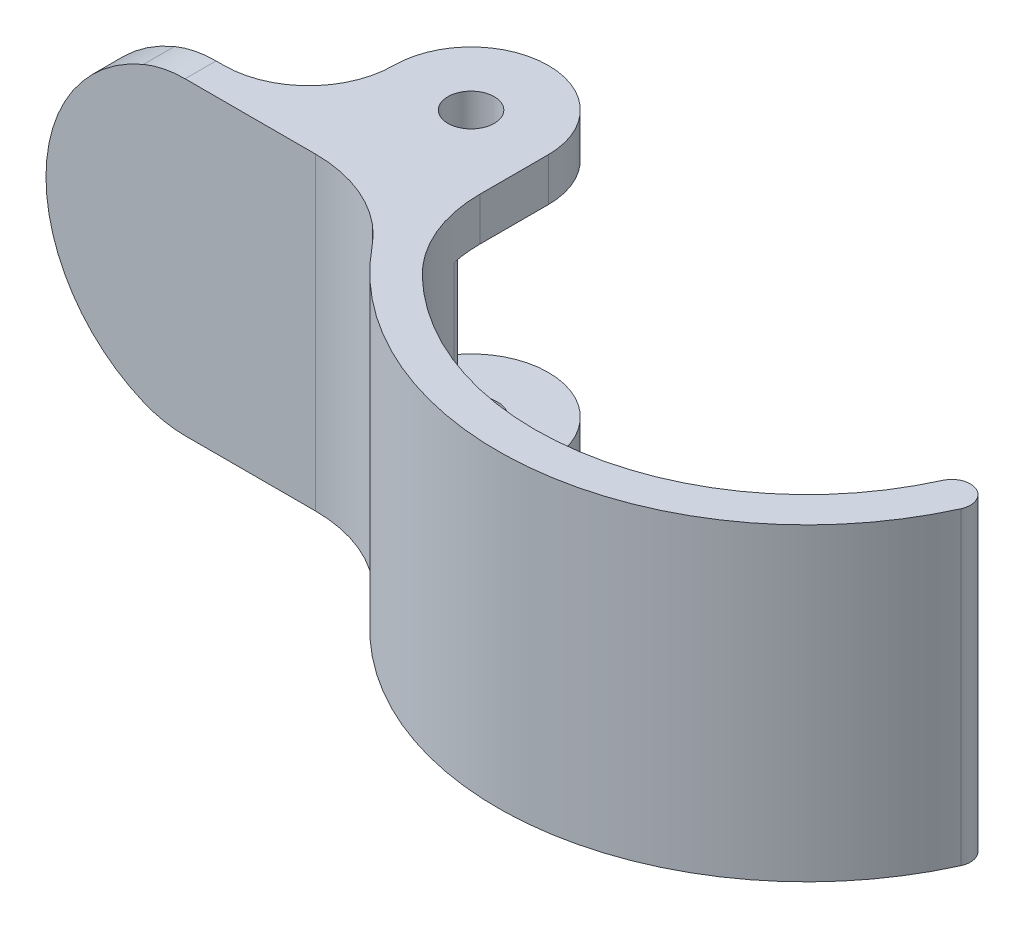
ISO-10303-21;
HEADER;
FILE_DESCRIPTION(('STEP AP214'),'2;1');
FILE_NAME('part.step','',(''),(''),'','','');
FILE_SCHEMA(('AUTOMOTIVE_DESIGN { 1 0 10303 214 1 1 1 1 }'));
ENDSEC;
DATA;
#1=APPLICATION_CONTEXT('core data for automotive mechanical design processes');
#2=APPLICATION_PROTOCOL_DEFINITION('international standard','automotive_design',2000,#1);
#3=PRODUCT_CONTEXT('',#1,'mechanical');
#4=PRODUCT('Part','Part','',(#3));
#5=PRODUCT_RELATED_PRODUCT_CATEGORY('part','',(#4));
#6=PRODUCT_DEFINITION_FORMATION('','',#4);
#7=PRODUCT_DEFINITION_CONTEXT('part definition',#1,'design');
#8=PRODUCT_DEFINITION('design','',#6,#7);
#9=PRODUCT_DEFINITION_SHAPE('','',#8);
#10=(LENGTH_UNIT() NAMED_UNIT(*) SI_UNIT(.MILLI.,.METRE.));
#11=(NAMED_UNIT(*) PLANE_ANGLE_UNIT() SI_UNIT($,.RADIAN.));
#12=(NAMED_UNIT(*) SI_UNIT($,.STERADIAN.) SOLID_ANGLE_UNIT());
#13=UNCERTAINTY_MEASURE_WITH_UNIT(LENGTH_MEASURE(1.E-05),#10,'distance_accuracy_value','');
#14=(GEOMETRIC_REPRESENTATION_CONTEXT(3) GLOBAL_UNCERTAINTY_ASSIGNED_CONTEXT((#13)) GLOBAL_UNIT_ASSIGNED_CONTEXT((#10,
#11,#12)) REPRESENTATION_CONTEXT('',''));
#15=CARTESIAN_POINT('',(0.,0.,0.));
#16=DIRECTION('',(0.,0.,1.));
#17=DIRECTION('',(1.,0.,0.));
#18=AXIS2_PLACEMENT_3D('',#15,#16,#17);
#19=CARTESIAN_POINT('',(5.,-10.,2.));
#20=DIRECTION('',(-1.,0.,0.));
#21=DIRECTION('',(0.,0.,1.));
#22=AXIS2_PLACEMENT_3D('',#19,#20,#21);
#23=PLANE('',#22);
#24=DIRECTION('',(0.,0.,-1.));
#25=VECTOR('',#24,1.);
#26=CARTESIAN_POINT('',(5.,10.,2.));
#27=LINE('',#26,#25);
#28=CARTESIAN_POINT('',(5.,10.,-1.06686940409686));
#29=VERTEX_POINT('',#28);
#30=CARTESIAN_POINT('',(5.,10.,-5.5));
#31=VERTEX_POINT('',#30);
#32=EDGE_CURVE('E262',#29,#31,#27,.T.);
#33=ORIENTED_EDGE('',*,*,#32,.F.);
#34=DIRECTION('',(0.,1.,0.));
#35=VECTOR('',#34,1.);
#36=CARTESIAN_POINT('',(5.,-10.,-1.06686940409686));
#37=LINE('',#36,#35);
#38=CARTESIAN_POINT('',(5.,7.2,-1.06686940409686));
#39=VERTEX_POINT('',#38);
#40=EDGE_CURVE('E305',#29,#39,#37,.F.);
#41=ORIENTED_EDGE('',*,*,#40,.T.);
#42=DIRECTION('',(0.,0.,-1.));
#43=VECTOR('',#42,1.);
#44=CARTESIAN_POINT('',(5.,7.2,0.));
#45=LINE('',#44,#43);
#46=CARTESIAN_POINT('',(5.,7.2,-5.5));
#47=VERTEX_POINT('',#46);
#48=EDGE_CURVE('E234',#39,#47,#45,.T.);
#49=ORIENTED_EDGE('',*,*,#48,.T.);
#50=DIRECTION('',(0.,1.,0.));
#51=VECTOR('',#50,1.);
#52=CARTESIAN_POINT('',(5.,7.2,-5.5));
#53=LINE('',#52,#51);
#54=EDGE_CURVE('E242',#47,#31,#53,.T.);
#55=ORIENTED_EDGE('',*,*,#54,.T.);
#56=EDGE_LOOP('',(#33,#41,#49,#55));
#57=FACE_BOUND('',#56,.T.);
#58=ADVANCED_FACE('F33',(#57),#23,.F.);
#59=DIRECTION('',(0.,0.,-1.));
#60=VECTOR('',#59,1.);
#61=CARTESIAN_POINT('',(5.,-7.2,0.));
#62=LINE('',#61,#60);
#63=CARTESIAN_POINT('',(5.,-7.2,-1.06686940409686));
#64=VERTEX_POINT('',#63);
#65=CARTESIAN_POINT('',(5.,-7.2,-5.5));
#66=VERTEX_POINT('',#65);
#67=EDGE_CURVE('E211',#64,#66,#62,.T.);
#68=ORIENTED_EDGE('',*,*,#67,.F.);
#69=DIRECTION('',(0.,1.,0.));
#70=VECTOR('',#69,1.);
#71=CARTESIAN_POINT('',(5.,-10.,-1.06686940409686));
#72=LINE('',#71,#70);
#73=CARTESIAN_POINT('',(5.,-10.,-1.06686940409686));
#74=VERTEX_POINT('',#73);
#75=EDGE_CURVE('E303',#64,#74,#72,.F.);
#76=ORIENTED_EDGE('',*,*,#75,.T.);
#77=DIRECTION('',(0.,0.,-1.));
#78=VECTOR('',#77,1.);
#79=CARTESIAN_POINT('',(5.,-10.,2.));
#80=LINE('',#79,#78);
#81=CARTESIAN_POINT('',(5.,-10.,-5.5));
#82=VERTEX_POINT('',#81);
#83=EDGE_CURVE('E257',#74,#82,#80,.T.);
#84=ORIENTED_EDGE('',*,*,#83,.T.);
#85=DIRECTION('',(0.,-1.,0.));
#86=VECTOR('',#85,1.);
#87=CARTESIAN_POINT('',(5.,-7.2,-5.5));
#88=LINE('',#87,#86);
#89=EDGE_CURVE('E222',#66,#82,#88,.T.);
#90=ORIENTED_EDGE('',*,*,#89,.F.);
#91=EDGE_LOOP('',(#68,#76,#84,#90));
#92=FACE_BOUND('',#91,.T.);
#93=ADVANCED_FACE('F385',(#92),#23,.F.);
#94=CARTESIAN_POINT('',(-12.,10.,2.));
#95=DIRECTION('',(0.,-1.,0.));
#96=DIRECTION('',(0.,0.,-1.));
#97=AXIS2_PLACEMENT_3D('',#94,#95,#96);
#98=PLANE('',#97);
#99=DIRECTION('',(-1.,0.,0.));
#100=VECTOR('',#99,1.);
#101=CARTESIAN_POINT('',(-12.,10.,2.));
#102=LINE('',#101,#100);
#103=CARTESIAN_POINT('',(-2.56234204113904,10.,2.));
#104=VERTEX_POINT('',#103);
#105=CARTESIAN_POINT('',(-11.,10.,2.));
#106=VERTEX_POINT('',#105);
#107=EDGE_CURVE('E251',#104,#106,#102,.T.);
#108=ORIENTED_EDGE('',*,*,#107,.F.);
#109=CARTESIAN_POINT('',(-2.56234204113904,10.,11.));
#110=DIRECTION('',(0.,-1.,0.));
#111=DIRECTION('',(0.,0.,-1.));
#112=AXIS2_PLACEMENT_3D('',#109,#110,#111);
#113=CIRCLE('',#112,9.);
#114=CARTESIAN_POINT('',(4.42955467771192,10.,5.33313311671068));
#115=VERTEX_POINT('',#114);
#116=EDGE_CURVE('E172',#104,#115,#113,.T.);
#117=ORIENTED_EDGE('',*,*,#116,.T.);
#118=CARTESIAN_POINT('',(19.9671029418252,10.,-7.25990440171003));
#119=DIRECTION('',(0.,1.,0.));
#120=DIRECTION('',(0.,0.,1.));
#121=AXIS2_PLACEMENT_3D('',#118,#119,#120);
#122=CIRCLE('',#121,20.);
#123=CARTESIAN_POINT('',(38.1863041442966,10.,0.989986963869551));
#124=VERTEX_POINT('',#123);
#125=EDGE_CURVE('E164',#115,#124,#122,.T.);
#126=ORIENTED_EDGE('',*,*,#125,.T.);
#127=CARTESIAN_POINT('',(37.0931520721483,10.,0.494993481934777));
#128=DIRECTION('',(0.,1.,0.));
#129=DIRECTION('',(0.,0.,-1.));
#130=AXIS2_PLACEMENT_3D('',#127,#128,#129);
#131=CIRCLE('',#130,1.2);
#132=CARTESIAN_POINT('',(36.,10.,0.));
#133=VERTEX_POINT('',#132);
#134=EDGE_CURVE('E171',#124,#133,#131,.T.);
#135=ORIENTED_EDGE('',*,*,#134,.T.);
#136=CARTESIAN_POINT('',(19.9671029418252,10.,-7.25990440171003));
#137=DIRECTION('',(0.,-1.,0.));
#138=DIRECTION('',(0.,0.,1.));
#139=AXIS2_PLACEMENT_3D('',#136,#137,#138);
#140=CIRCLE('',#139,17.6);
#141=CARTESIAN_POINT('',(7.75535738646205,10.,5.41421373294018));
#142=VERTEX_POINT('',#141);
#143=EDGE_CURVE('E185',#133,#142,#140,.T.);
#144=ORIENTED_EDGE('',*,*,#143,.T.);
#145=CARTESIAN_POINT('',(14.,10.,-1.06686940409686));
#146=DIRECTION('',(0.,-1.,0.));
#147=DIRECTION('',(0.,0.,-1.));
#148=AXIS2_PLACEMENT_3D('',#145,#146,#147);
#149=CIRCLE('',#148,9.);
#150=EDGE_CURVE('E307',#142,#29,#149,.T.);
#151=ORIENTED_EDGE('',*,*,#150,.T.);
#152=ORIENTED_EDGE('',*,*,#32,.T.);
#153=CARTESIAN_POINT('',(0.,10.,-5.5));
#154=DIRECTION('',(0.,1.,0.));
#155=DIRECTION('',(0.,0.,-1.));
#156=AXIS2_PLACEMENT_3D('',#153,#154,#155);
#157=CIRCLE('',#156,5.);
#158=CARTESIAN_POINT('',(-5.,10.,-5.5));
#159=VERTEX_POINT('',#158);
#160=EDGE_CURVE('E231',#31,#159,#157,.T.);
#161=ORIENTED_EDGE('',*,*,#160,.T.);
#162=CARTESIAN_POINT('',(-10.5,10.,-5.5));
#163=DIRECTION('',(0.,-1.,0.));
#164=DIRECTION('',(0.,0.,-1.));
#165=AXIS2_PLACEMENT_3D('',#162,#163,#164);
#166=CIRCLE('',#165,5.5);
#167=CARTESIAN_POINT('',(-10.5,10.,0.));
#168=VERTEX_POINT('',#167);
#169=EDGE_CURVE('E267',#159,#168,#166,.T.);
#170=ORIENTED_EDGE('',*,*,#169,.T.);
#171=DIRECTION('',(-1.,0.,0.));
#172=VECTOR('',#171,1.);
#173=CARTESIAN_POINT('',(-12.,10.,0.));
#174=LINE('',#173,#172);
#175=CARTESIAN_POINT('',(-11.,10.,0.));
#176=VERTEX_POINT('',#175);
#177=EDGE_CURVE('E248',#168,#176,#174,.T.);
#178=ORIENTED_EDGE('',*,*,#177,.T.);
#179=DIRECTION('',(0.,0.,-1.));
#180=VECTOR('',#179,1.);
#181=CARTESIAN_POINT('',(-11.,10.,2.));
#182=LINE('',#181,#180);
#183=EDGE_CURVE('E297',#176,#106,#182,.F.);
#184=ORIENTED_EDGE('',*,*,#183,.T.);
#185=EDGE_LOOP('',(#108,#117,#126,#135,#144,#151,#152,#161,#170,#178,#184));
#186=FACE_BOUND('',#185,.T.);
#187=CARTESIAN_POINT('',(0.,10.,-5.5));
#188=DIRECTION('',(0.,1.,0.));
#189=DIRECTION('',(0.,0.,1.));
#190=AXIS2_PLACEMENT_3D('',#187,#188,#189);
#191=CIRCLE('',#190,1.5);
#192=CARTESIAN_POINT('',(0.,10.,-4.));
#193=VERTEX_POINT('',#192);
#194=EDGE_CURVE('E225',#193,#193,#191,.T.);
#195=ORIENTED_EDGE('',*,*,#194,.F.);
#196=EDGE_LOOP('',(#195));
#197=FACE_BOUND('',#196,.T.);
#198=ADVANCED_FACE('F167',(#186,#197),#98,.F.);
#199=CARTESIAN_POINT('',(-12.,-10.,2.));
#200=DIRECTION('',(0.,1.,0.));
#201=DIRECTION('',(0.,0.,1.));
#202=AXIS2_PLACEMENT_3D('',#199,#200,#201);
#203=PLANE('',#202);
#204=CARTESIAN_POINT('',(19.9671029418252,-10.,-7.25990440171003));
#205=DIRECTION('',(0.,1.,0.));
#206=DIRECTION('',(0.,0.,1.));
#207=AXIS2_PLACEMENT_3D('',#204,#205,#206);
#208=CIRCLE('',#207,20.);
#209=CARTESIAN_POINT('',(38.1863041442966,-10.,0.98998696386955));
#210=VERTEX_POINT('',#209);
#211=CARTESIAN_POINT('',(4.42955467771192,-10.,5.33313311671068));
#212=VERTEX_POINT('',#211);
#213=EDGE_CURVE('E181',#210,#212,#208,.F.);
#214=ORIENTED_EDGE('',*,*,#213,.T.);
#215=CARTESIAN_POINT('',(-2.56234204113904,-10.,11.));
#216=DIRECTION('',(0.,1.,0.));
#217=DIRECTION('',(0.,0.,1.));
#218=AXIS2_PLACEMENT_3D('',#215,#216,#217);
#219=CIRCLE('',#218,9.);
#220=CARTESIAN_POINT('',(-2.56234204113904,-10.,2.));
#221=VERTEX_POINT('',#220);
#222=EDGE_CURVE('E319',#212,#221,#219,.T.);
#223=ORIENTED_EDGE('',*,*,#222,.T.);
#224=DIRECTION('',(1.,0.,0.));
#225=VECTOR('',#224,1.);
#226=CARTESIAN_POINT('',(-12.,-10.,2.));
#227=LINE('',#226,#225);
#228=CARTESIAN_POINT('',(-11.,-10.,2.));
#229=VERTEX_POINT('',#228);
#230=EDGE_CURVE('E253',#229,#221,#227,.T.);
#231=ORIENTED_EDGE('',*,*,#230,.F.);
#232=DIRECTION('',(0.,0.,-1.));
#233=VECTOR('',#232,1.);
#234=CARTESIAN_POINT('',(-11.,-10.,0.));
#235=LINE('',#234,#233);
#236=CARTESIAN_POINT('',(-11.,-10.,0.));
#237=VERTEX_POINT('',#236);
#238=EDGE_CURVE('E279',#229,#237,#235,.T.);
#239=ORIENTED_EDGE('',*,*,#238,.T.);
#240=DIRECTION('',(1.,0.,0.));
#241=VECTOR('',#240,1.);
#242=CARTESIAN_POINT('',(-12.,-10.,0.));
#243=LINE('',#242,#241);
#244=CARTESIAN_POINT('',(-10.5,-10.,0.));
#245=VERTEX_POINT('',#244);
#246=EDGE_CURVE('E254',#237,#245,#243,.T.);
#247=ORIENTED_EDGE('',*,*,#246,.T.);
#248=CARTESIAN_POINT('',(-10.5,-10.,-5.5));
#249=DIRECTION('',(0.,1.,0.));
#250=DIRECTION('',(0.,0.,1.));
#251=AXIS2_PLACEMENT_3D('',#248,#249,#250);
#252=CIRCLE('',#251,5.5);
#253=CARTESIAN_POINT('',(-5.,-10.,-5.5));
#254=VERTEX_POINT('',#253);
#255=EDGE_CURVE('E274',#245,#254,#252,.T.);
#256=ORIENTED_EDGE('',*,*,#255,.T.);
#257=CARTESIAN_POINT('',(0.,-10.,-5.5));
#258=DIRECTION('',(0.,1.,0.));
#259=DIRECTION('',(0.,0.,-1.));
#260=AXIS2_PLACEMENT_3D('',#257,#258,#259);
#261=CIRCLE('',#260,5.);
#262=EDGE_CURVE('E214',#82,#254,#261,.T.);
#263=ORIENTED_EDGE('',*,*,#262,.F.);
#264=ORIENTED_EDGE('',*,*,#83,.F.);
#265=CARTESIAN_POINT('',(14.,-10.,-1.06686940409686));
#266=DIRECTION('',(0.,1.,0.));
#267=DIRECTION('',(0.,0.,1.));
#268=AXIS2_PLACEMENT_3D('',#265,#266,#267);
#269=CIRCLE('',#268,9.);
#270=CARTESIAN_POINT('',(7.75535738646205,-10.,5.41421373294018));
#271=VERTEX_POINT('',#270);
#272=EDGE_CURVE('E311',#74,#271,#269,.T.);
#273=ORIENTED_EDGE('',*,*,#272,.T.);
#274=CARTESIAN_POINT('',(19.9671029418252,-10.,-7.25990440171003));
#275=DIRECTION('',(0.,1.,0.));
#276=DIRECTION('',(0.,0.,1.));
#277=AXIS2_PLACEMENT_3D('',#274,#275,#276);
#278=CIRCLE('',#277,17.6);
#279=CARTESIAN_POINT('',(36.,-10.,0.));
#280=VERTEX_POINT('',#279);
#281=EDGE_CURVE('E194',#271,#280,#278,.T.);
#282=ORIENTED_EDGE('',*,*,#281,.T.);
#283=CARTESIAN_POINT('',(37.0931520721483,-10.,0.494993481934777));
#284=DIRECTION('',(0.,1.,0.));
#285=DIRECTION('',(0.,0.,1.));
#286=AXIS2_PLACEMENT_3D('',#283,#284,#285);
#287=CIRCLE('',#286,1.2);
#288=EDGE_CURVE('E196',#280,#210,#287,.F.);
#289=ORIENTED_EDGE('',*,*,#288,.T.);
#290=EDGE_LOOP('',(#214,#223,#231,#239,#247,#256,#263,#264,#273,#282,#289));
#291=FACE_BOUND('',#290,.T.);
#292=CARTESIAN_POINT('',(0.,-10.,-5.5));
#293=DIRECTION('',(0.,-1.,0.));
#294=DIRECTION('',(0.,0.,-1.));
#295=AXIS2_PLACEMENT_3D('',#292,#293,#294);
#296=CIRCLE('',#295,3.15);
#297=CARTESIAN_POINT('',(0.,-10.,-8.65));
#298=VERTEX_POINT('',#297);
#299=EDGE_CURVE('E204',#298,#298,#296,.T.);
#300=ORIENTED_EDGE('',*,*,#299,.F.);
#301=EDGE_LOOP('',(#300));
#302=FACE_BOUND('',#301,.T.);
#303=ADVANCED_FACE('F370',(#291,#302),#203,.F.);
#304=CARTESIAN_POINT('',(0.,0.,2.));
#305=DIRECTION('',(0.,0.,-1.));
#306=DIRECTION('',(-1.,0.,0.));
#307=AXIS2_PLACEMENT_3D('',#304,#305,#306);
#308=PLANE('',#307);
#309=ORIENTED_EDGE('',*,*,#230,.T.);
#310=DIRECTION('',(0.,1.,0.));
#311=VECTOR('',#310,1.);
#312=CARTESIAN_POINT('',(-2.56234204113904,0.,2.));
#313=LINE('',#312,#311);
#314=EDGE_CURVE('E313',#221,#104,#313,.T.);
#315=ORIENTED_EDGE('',*,*,#314,.T.);
#316=ORIENTED_EDGE('',*,*,#107,.T.);
#317=CARTESIAN_POINT('',(-11.,3.,2.));
#318=DIRECTION('',(0.,0.,-1.));
#319=DIRECTION('',(-1.,0.,0.));
#320=AXIS2_PLACEMENT_3D('',#317,#318,#319);
#321=CIRCLE('',#320,7.);
#322=CARTESIAN_POINT('',(-13.6923076923077,9.46153846153847,2.));
#323=VERTEX_POINT('',#322);
#324=EDGE_CURVE('E293',#106,#323,#321,.F.);
#325=ORIENTED_EDGE('',*,*,#324,.T.);
#326=CARTESIAN_POINT('',(-9.75,0.,2.));
#327=DIRECTION('',(0.,0.,1.));
#328=DIRECTION('',(-1.,0.,0.));
#329=AXIS2_PLACEMENT_3D('',#326,#327,#328);
#330=CIRCLE('',#329,10.25);
#331=CARTESIAN_POINT('',(-13.6923076923077,-9.46153846153846,2.));
#332=VERTEX_POINT('',#331);
#333=EDGE_CURVE('E198',#323,#332,#330,.T.);
#334=ORIENTED_EDGE('',*,*,#333,.T.);
#335=CARTESIAN_POINT('',(-11.,-3.,2.));
#336=DIRECTION('',(0.,0.,-1.));
#337=DIRECTION('',(-1.,0.,0.));
#338=AXIS2_PLACEMENT_3D('',#335,#336,#337);
#339=CIRCLE('',#338,7.);
#340=EDGE_CURVE('E295',#332,#229,#339,.F.);
#341=ORIENTED_EDGE('',*,*,#340,.T.);
#342=EDGE_LOOP('',(#309,#315,#316,#325,#334,#341));
#343=FACE_BOUND('',#342,.T.);
#344=ADVANCED_FACE('F363',(#343),#308,.F.);
#345=CARTESIAN_POINT('',(0.,0.,0.));
#346=DIRECTION('',(0.,0.,-1.));
#347=DIRECTION('',(-1.,0.,0.));
#348=AXIS2_PLACEMENT_3D('',#345,#346,#347);
#349=PLANE('',#348);
#350=DIRECTION('',(1.,0.,0.));
#351=VECTOR('',#350,1.);
#352=CARTESIAN_POINT('',(5.,7.2,0.));
#353=LINE('',#352,#351);
#354=CARTESIAN_POINT('',(-10.5,7.2,0.));
#355=VERTEX_POINT('',#354);
#356=CARTESIAN_POINT('',(4.21592871722573,7.2,0.));
#357=VERTEX_POINT('',#356);
#358=EDGE_CURVE('E239',#355,#357,#353,.T.);
#359=ORIENTED_EDGE('',*,*,#358,.T.);
#360=DIRECTION('',(0.,-1.,0.));
#361=VECTOR('',#360,1.);
#362=CARTESIAN_POINT('',(4.21592871722573,-7.2,0.));
#363=LINE('',#362,#361);
#364=CARTESIAN_POINT('',(4.21592871722573,-7.2,0.));
#365=VERTEX_POINT('',#364);
#366=EDGE_CURVE('E321',#357,#365,#363,.T.);
#367=ORIENTED_EDGE('',*,*,#366,.T.);
#368=DIRECTION('',(1.,0.,0.));
#369=VECTOR('',#368,1.);
#370=CARTESIAN_POINT('',(5.,-7.2,0.));
#371=LINE('',#370,#369);
#372=CARTESIAN_POINT('',(-10.5,-7.2,0.));
#373=VERTEX_POINT('',#372);
#374=EDGE_CURVE('E213',#373,#365,#371,.T.);
#375=ORIENTED_EDGE('',*,*,#374,.F.);
#376=DIRECTION('',(0.,-1.,0.));
#377=VECTOR('',#376,1.);
#378=CARTESIAN_POINT('',(-10.5,0.,0.));
#379=LINE('',#378,#377);
#380=EDGE_CURVE('E271',#373,#245,#379,.T.);
#381=ORIENTED_EDGE('',*,*,#380,.T.);
#382=ORIENTED_EDGE('',*,*,#246,.F.);
#383=CARTESIAN_POINT('',(-11.,-3.,0.));
#384=DIRECTION('',(0.,0.,-1.));
#385=DIRECTION('',(-1.,0.,0.));
#386=AXIS2_PLACEMENT_3D('',#383,#384,#385);
#387=CIRCLE('',#386,7.);
#388=CARTESIAN_POINT('',(-13.6923076923077,-9.46153846153846,0.));
#389=VERTEX_POINT('',#388);
#390=EDGE_CURVE('E286',#237,#389,#387,.T.);
#391=ORIENTED_EDGE('',*,*,#390,.T.);
#392=CARTESIAN_POINT('',(-9.75,0.,0.));
#393=DIRECTION('',(0.,0.,-1.));
#394=DIRECTION('',(-1.,0.,0.));
#395=AXIS2_PLACEMENT_3D('',#392,#393,#394);
#396=CIRCLE('',#395,10.25);
#397=CARTESIAN_POINT('',(-13.6923076923077,9.46153846153847,0.));
#398=VERTEX_POINT('',#397);
#399=EDGE_CURVE('E201',#398,#389,#396,.F.);
#400=ORIENTED_EDGE('',*,*,#399,.F.);
#401=CARTESIAN_POINT('',(-11.,3.,0.));
#402=DIRECTION('',(0.,0.,-1.));
#403=DIRECTION('',(-1.,0.,0.));
#404=AXIS2_PLACEMENT_3D('',#401,#402,#403);
#405=CIRCLE('',#404,7.);
#406=EDGE_CURVE('E284',#398,#176,#405,.T.);
#407=ORIENTED_EDGE('',*,*,#406,.T.);
#408=ORIENTED_EDGE('',*,*,#177,.F.);
#409=DIRECTION('',(0.,1.,0.));
#410=VECTOR('',#409,1.);
#411=CARTESIAN_POINT('',(-10.5,7.2,0.));
#412=LINE('',#411,#410);
#413=EDGE_CURVE('E264',#168,#355,#412,.F.);
#414=ORIENTED_EDGE('',*,*,#413,.T.);
#415=EDGE_LOOP('',(#359,#367,#375,#381,#382,#391,#400,#407,#408,#414));
#416=FACE_BOUND('',#415,.T.);
#417=ADVANCED_FACE('F351',(#416),#349,.T.);
#418=CARTESIAN_POINT('',(0.,7.2,-5.5));
#419=DIRECTION('',(0.,1.,0.));
#420=DIRECTION('',(0.,0.,1.));
#421=AXIS2_PLACEMENT_3D('',#418,#419,#420);
#422=CYLINDRICAL_SURFACE('',#421,5.);
#423=ORIENTED_EDGE('',*,*,#160,.F.);
#424=ORIENTED_EDGE('',*,*,#54,.F.);
#425=CARTESIAN_POINT('',(0.,7.2,-5.5));
#426=DIRECTION('',(0.,1.,0.));
#427=DIRECTION('',(0.,0.,-1.));
#428=AXIS2_PLACEMENT_3D('',#425,#426,#427);
#429=CIRCLE('',#428,5.);
#430=CARTESIAN_POINT('',(-5.,7.2,-5.5));
#431=VERTEX_POINT('',#430);
#432=EDGE_CURVE('E236',#47,#431,#429,.T.);
#433=ORIENTED_EDGE('',*,*,#432,.T.);
#434=DIRECTION('',(0.,1.,0.));
#435=VECTOR('',#434,1.);
#436=CARTESIAN_POINT('',(-5.,7.2,-5.5));
#437=LINE('',#436,#435);
#438=EDGE_CURVE('E245',#431,#159,#437,.T.);
#439=ORIENTED_EDGE('',*,*,#438,.T.);
#440=EDGE_LOOP('',(#423,#424,#433,#439));
#441=FACE_BOUND('',#440,.T.);
#442=ADVANCED_FACE('F344',(#441),#422,.T.);
#443=CARTESIAN_POINT('',(0.,7.2,-5.5));
#444=DIRECTION('',(0.,-1.,0.));
#445=DIRECTION('',(0.,0.,-1.));
#446=AXIS2_PLACEMENT_3D('',#443,#444,#445);
#447=PLANE('',#446);
#448=CARTESIAN_POINT('',(0.,7.2,-5.5));
#449=DIRECTION('',(0.,1.,0.));
#450=DIRECTION('',(0.,0.,1.));
#451=AXIS2_PLACEMENT_3D('',#448,#449,#450);
#452=CIRCLE('',#451,1.5);
#453=CARTESIAN_POINT('',(0.,7.2,-4.));
#454=VERTEX_POINT('',#453);
#455=EDGE_CURVE('E228',#454,#454,#452,.T.);
#456=ORIENTED_EDGE('',*,*,#455,.T.);
#457=EDGE_LOOP('',(#456));
#458=FACE_BOUND('',#457,.T.);
#459=ORIENTED_EDGE('',*,*,#48,.F.);
#460=CARTESIAN_POINT('',(14.,7.2,-1.06686940409686));
#461=DIRECTION('',(0.,-1.,0.));
#462=DIRECTION('',(0.,0.,-1.));
#463=AXIS2_PLACEMENT_3D('',#460,#461,#462);
#464=CIRCLE('',#463,9.);
#465=CARTESIAN_POINT('',(5.19433584550316,7.2,0.793313059590314));
#466=VERTEX_POINT('',#465);
#467=EDGE_CURVE('E55',#39,#466,#464,.F.);
#468=ORIENTED_EDGE('',*,*,#467,.T.);
#469=CARTESIAN_POINT('',(4.21592871722573,7.2,1.));
#470=DIRECTION('',(0.,-1.,0.));
#471=DIRECTION('',(0.,0.,-1.));
#472=AXIS2_PLACEMENT_3D('',#469,#470,#471);
#473=CIRCLE('',#472,1.);
#474=EDGE_CURVE('E11',#466,#357,#473,.F.);
#475=ORIENTED_EDGE('',*,*,#474,.T.);
#476=ORIENTED_EDGE('',*,*,#358,.F.);
#477=CARTESIAN_POINT('',(-10.5,7.2,-5.5));
#478=DIRECTION('',(0.,-1.,0.));
#479=DIRECTION('',(0.,0.,-1.));
#480=AXIS2_PLACEMENT_3D('',#477,#478,#479);
#481=CIRCLE('',#480,5.5);
#482=EDGE_CURVE('E269',#355,#431,#481,.F.);
#483=ORIENTED_EDGE('',*,*,#482,.T.);
#484=ORIENTED_EDGE('',*,*,#432,.F.);
#485=EDGE_LOOP('',(#459,#468,#475,#476,#483,#484));
#486=FACE_BOUND('',#485,.T.);
#487=ADVANCED_FACE('F339',(#458,#486),#447,.T.);
#488=CARTESIAN_POINT('',(0.,7.2,-5.5));
#489=DIRECTION('',(0.,1.,0.));
#490=DIRECTION('',(0.,0.,1.));
#491=AXIS2_PLACEMENT_3D('',#488,#489,#490);
#492=CYLINDRICAL_SURFACE('',#491,1.5);
#493=ORIENTED_EDGE('',*,*,#455,.F.);
#494=EDGE_LOOP('',(#493));
#495=FACE_BOUND('',#494,.T.);
#496=ORIENTED_EDGE('',*,*,#194,.T.);
#497=EDGE_LOOP('',(#496));
#498=FACE_BOUND('',#497,.T.);
#499=ADVANCED_FACE('F412',(#495,#498),#492,.F.);
#500=CARTESIAN_POINT('',(-10.5,7.2,-5.5));
#501=DIRECTION('',(0.,-1.,0.));
#502=DIRECTION('',(0.,0.,-1.));
#503=AXIS2_PLACEMENT_3D('',#500,#501,#502);
#504=CYLINDRICAL_SURFACE('',#503,5.5);
#505=ORIENTED_EDGE('',*,*,#482,.F.);
#506=ORIENTED_EDGE('',*,*,#413,.F.);
#507=ORIENTED_EDGE('',*,*,#169,.F.);
#508=ORIENTED_EDGE('',*,*,#438,.F.);
#509=EDGE_LOOP('',(#505,#506,#507,#508));
#510=FACE_BOUND('',#509,.T.);
#511=ADVANCED_FACE('F346',(#510),#504,.F.);
#512=CARTESIAN_POINT('',(0.,-7.2,-5.5));
#513=DIRECTION('',(0.,1.,0.));
#514=DIRECTION('',(0.,0.,-1.));
#515=AXIS2_PLACEMENT_3D('',#512,#513,#514);
#516=PLANE('',#515);
#517=CARTESIAN_POINT('',(0.,-7.2,-5.5));
#518=DIRECTION('',(0.,1.,0.));
#519=DIRECTION('',(0.,0.,1.));
#520=AXIS2_PLACEMENT_3D('',#517,#518,#519);
#521=CIRCLE('',#520,1.69999999999999);
#522=CARTESIAN_POINT('',(0.,-7.2,-3.80000000000001));
#523=VERTEX_POINT('',#522);
#524=EDGE_CURVE('E210',#523,#523,#521,.T.);
#525=ORIENTED_EDGE('',*,*,#524,.F.);
#526=EDGE_LOOP('',(#525));
#527=FACE_BOUND('',#526,.T.);
#528=ORIENTED_EDGE('',*,*,#374,.T.);
#529=CARTESIAN_POINT('',(4.21592871722573,-7.2,1.));
#530=DIRECTION('',(0.,1.,0.));
#531=DIRECTION('',(0.,0.,1.));
#532=AXIS2_PLACEMENT_3D('',#529,#530,#531);
#533=CIRCLE('',#532,1.);
#534=CARTESIAN_POINT('',(5.19433584550316,-7.2,0.793313059590314));
#535=VERTEX_POINT('',#534);
#536=EDGE_CURVE('E41',#365,#535,#533,.F.);
#537=ORIENTED_EDGE('',*,*,#536,.T.);
#538=CARTESIAN_POINT('',(14.,-7.2,-1.06686940409686));
#539=DIRECTION('',(0.,1.,0.));
#540=DIRECTION('',(0.,0.,1.));
#541=AXIS2_PLACEMENT_3D('',#538,#539,#540);
#542=CIRCLE('',#541,9.);
#543=EDGE_CURVE('E48',#535,#64,#542,.F.);
#544=ORIENTED_EDGE('',*,*,#543,.T.);
#545=ORIENTED_EDGE('',*,*,#67,.T.);
#546=CARTESIAN_POINT('',(0.,-7.2,-5.5));
#547=DIRECTION('',(0.,1.,0.));
#548=DIRECTION('',(0.,0.,-1.));
#549=AXIS2_PLACEMENT_3D('',#546,#547,#548);
#550=CIRCLE('',#549,5.);
#551=CARTESIAN_POINT('',(-5.,-7.2,-5.5));
#552=VERTEX_POINT('',#551);
#553=EDGE_CURVE('E217',#66,#552,#550,.T.);
#554=ORIENTED_EDGE('',*,*,#553,.T.);
#555=CARTESIAN_POINT('',(-10.5,-7.2,-5.5));
#556=DIRECTION('',(0.,1.,0.));
#557=DIRECTION('',(0.,0.,1.));
#558=AXIS2_PLACEMENT_3D('',#555,#556,#557);
#559=CIRCLE('',#558,5.5);
#560=EDGE_CURVE('E276',#552,#373,#559,.F.);
#561=ORIENTED_EDGE('',*,*,#560,.T.);
#562=EDGE_LOOP('',(#528,#537,#544,#545,#554,#561));
#563=FACE_BOUND('',#562,.T.);
#564=ADVANCED_FACE('F327',(#527,#563),#516,.T.);
#565=CARTESIAN_POINT('',(0.,-7.2,-5.5));
#566=DIRECTION('',(0.,-1.,0.));
#567=DIRECTION('',(0.,0.,-1.));
#568=AXIS2_PLACEMENT_3D('',#565,#566,#567);
#569=CYLINDRICAL_SURFACE('',#568,5.);
#570=ORIENTED_EDGE('',*,*,#262,.T.);
#571=DIRECTION('',(0.,-1.,0.));
#572=VECTOR('',#571,1.);
#573=CARTESIAN_POINT('',(-5.,-7.2,-5.5));
#574=LINE('',#573,#572);
#575=EDGE_CURVE('E219',#552,#254,#574,.T.);
#576=ORIENTED_EDGE('',*,*,#575,.F.);
#577=ORIENTED_EDGE('',*,*,#553,.F.);
#578=ORIENTED_EDGE('',*,*,#89,.T.);
#579=EDGE_LOOP('',(#570,#576,#577,#578));
#580=FACE_BOUND('',#579,.T.);
#581=ADVANCED_FACE('F381',(#580),#569,.T.);
#582=CARTESIAN_POINT('',(-10.5,0.,-5.5));
#583=DIRECTION('',(0.,-1.,0.));
#584=DIRECTION('',(0.,0.,-1.));
#585=AXIS2_PLACEMENT_3D('',#582,#583,#584);
#586=CYLINDRICAL_SURFACE('',#585,5.5);
#587=ORIENTED_EDGE('',*,*,#560,.F.);
#588=ORIENTED_EDGE('',*,*,#575,.T.);
#589=ORIENTED_EDGE('',*,*,#255,.F.);
#590=ORIENTED_EDGE('',*,*,#380,.F.);
#591=EDGE_LOOP('',(#587,#588,#589,#590));
#592=FACE_BOUND('',#591,.T.);
#593=ADVANCED_FACE('F376',(#592),#586,.F.);
#594=CARTESIAN_POINT('',(0.,-10.,-5.5));
#595=DIRECTION('',(0.,-1.,0.));
#596=DIRECTION('',(0.,0.,-1.));
#597=AXIS2_PLACEMENT_3D('',#594,#595,#596);
#598=CYLINDRICAL_SURFACE('',#597,1.69999999999999);
#599=ORIENTED_EDGE('',*,*,#524,.T.);
#600=EDGE_LOOP('',(#599));
#601=FACE_BOUND('',#600,.T.);
#602=CARTESIAN_POINT('',(0.,-8.54999999999999,-5.5));
#603=DIRECTION('',(0.,-1.,0.));
#604=DIRECTION('',(0.,0.,-1.));
#605=AXIS2_PLACEMENT_3D('',#602,#603,#604);
#606=CIRCLE('',#605,1.69999999999999);
#607=CARTESIAN_POINT('',(0.,-8.54999999999999,-7.19999999999999));
#608=VERTEX_POINT('',#607);
#609=EDGE_CURVE('E207',#608,#608,#606,.T.);
#610=ORIENTED_EDGE('',*,*,#609,.T.);
#611=EDGE_LOOP('',(#610));
#612=FACE_BOUND('',#611,.T.);
#613=ADVANCED_FACE('F415',(#601,#612),#598,.F.);
#614=CARTESIAN_POINT('',(0.,-10.,-5.5));
#615=DIRECTION('',(0.,-1.,0.));
#616=DIRECTION('',(0.,0.,-1.));
#617=AXIS2_PLACEMENT_3D('',#614,#615,#616);
#618=CONICAL_SURFACE('',#617,3.15,0.78539816339745);
#619=ORIENTED_EDGE('',*,*,#609,.F.);
#620=EDGE_LOOP('',(#619));
#621=FACE_BOUND('',#620,.T.);
#622=ORIENTED_EDGE('',*,*,#299,.T.);
#623=EDGE_LOOP('',(#622));
#624=FACE_BOUND('',#623,.T.);
#625=ADVANCED_FACE('F432',(#621,#624),#618,.F.);
#626=CARTESIAN_POINT('',(-9.75,0.,-21.540659228538));
#627=DIRECTION('',(0.,0.,1.));
#628=DIRECTION('',(1.,0.,0.));
#629=AXIS2_PLACEMENT_3D('',#626,#627,#628);
#630=CYLINDRICAL_SURFACE('',#629,10.25);
#631=ORIENTED_EDGE('',*,*,#399,.T.);
#632=DIRECTION('',(0.,0.,1.));
#633=VECTOR('',#632,1.);
#634=CARTESIAN_POINT('',(-13.6923076923077,-9.46153846153846,-21.540659228538));
#635=LINE('',#634,#633);
#636=EDGE_CURVE('E291',#389,#332,#635,.T.);
#637=ORIENTED_EDGE('',*,*,#636,.T.);
#638=ORIENTED_EDGE('',*,*,#333,.F.);
#639=DIRECTION('',(0.,0.,1.));
#640=VECTOR('',#639,1.);
#641=CARTESIAN_POINT('',(-13.6923076923077,9.46153846153847,-21.540659228538));
#642=LINE('',#641,#640);
#643=EDGE_CURVE('E288',#323,#398,#642,.F.);
#644=ORIENTED_EDGE('',*,*,#643,.T.);
#645=EDGE_LOOP('',(#631,#637,#638,#644));
#646=FACE_BOUND('',#645,.T.);
#647=ADVANCED_FACE('F359',(#646),#630,.T.);
#648=CARTESIAN_POINT('',(-11.,-3.,-21.540659228538));
#649=DIRECTION('',(0.,0.,1.));
#650=DIRECTION('',(1.,0.,0.));
#651=AXIS2_PLACEMENT_3D('',#648,#649,#650);
#652=CYLINDRICAL_SURFACE('',#651,7.);
#653=ORIENTED_EDGE('',*,*,#340,.F.);
#654=ORIENTED_EDGE('',*,*,#636,.F.);
#655=ORIENTED_EDGE('',*,*,#390,.F.);
#656=ORIENTED_EDGE('',*,*,#238,.F.);
#657=EDGE_LOOP('',(#653,#654,#655,#656));
#658=FACE_BOUND('',#657,.T.);
#659=ADVANCED_FACE('F367',(#658),#652,.T.);
#660=CARTESIAN_POINT('',(-11.,3.,-21.540659228538));
#661=DIRECTION('',(0.,0.,1.));
#662=DIRECTION('',(1.,0.,0.));
#663=AXIS2_PLACEMENT_3D('',#660,#661,#662);
#664=CYLINDRICAL_SURFACE('',#663,7.);
#665=ORIENTED_EDGE('',*,*,#324,.F.);
#666=ORIENTED_EDGE('',*,*,#183,.F.);
#667=ORIENTED_EDGE('',*,*,#406,.F.);
#668=ORIENTED_EDGE('',*,*,#643,.F.);
#669=EDGE_LOOP('',(#665,#666,#667,#668));
#670=FACE_BOUND('',#669,.T.);
#671=ADVANCED_FACE('F356',(#670),#664,.T.);
#672=CARTESIAN_POINT('',(19.9671029418252,-48.4786780390851,-7.25990440171003));
#673=DIRECTION('',(0.,1.,0.));
#674=DIRECTION('',(0.,0.,1.));
#675=AXIS2_PLACEMENT_3D('',#672,#673,#674);
#676=CYLINDRICAL_SURFACE('',#675,17.6);
#677=ORIENTED_EDGE('',*,*,#281,.F.);
#678=DIRECTION('',(0.,1.,0.));
#679=VECTOR('',#678,1.);
#680=CARTESIAN_POINT('',(7.75535738646205,-48.4786780390851,5.41421373294018));
#681=LINE('',#680,#679);
#682=EDGE_CURVE('E300',#271,#142,#681,.T.);
#683=ORIENTED_EDGE('',*,*,#682,.T.);
#684=ORIENTED_EDGE('',*,*,#143,.F.);
#685=DIRECTION('',(0.,1.,0.));
#686=VECTOR('',#685,1.);
#687=CARTESIAN_POINT('',(36.,-48.4786780390851,0.));
#688=LINE('',#687,#686);
#689=EDGE_CURVE('E184',#280,#133,#688,.T.);
#690=ORIENTED_EDGE('',*,*,#689,.F.);
#691=EDGE_LOOP('',(#677,#683,#684,#690));
#692=FACE_BOUND('',#691,.T.);
#693=ADVANCED_FACE('F389',(#692),#676,.F.);
#694=CARTESIAN_POINT('',(19.9671029418252,-48.4786780390851,-7.25990440171003));
#695=DIRECTION('',(0.,1.,0.));
#696=DIRECTION('',(0.,0.,1.));
#697=AXIS2_PLACEMENT_3D('',#694,#695,#696);
#698=CYLINDRICAL_SURFACE('',#697,20.);
#699=ORIENTED_EDGE('',*,*,#125,.F.);
#700=DIRECTION('',(0.,1.,0.));
#701=VECTOR('',#700,1.);
#702=CARTESIAN_POINT('',(4.42955467771192,-48.4786780390851,5.33313311671068));
#703=LINE('',#702,#701);
#704=EDGE_CURVE('E316',#115,#212,#703,.F.);
#705=ORIENTED_EDGE('',*,*,#704,.T.);
#706=ORIENTED_EDGE('',*,*,#213,.F.);
#707=DIRECTION('',(0.,1.,0.));
#708=VECTOR('',#707,1.);
#709=CARTESIAN_POINT('',(38.1863041442966,-48.4786780390851,0.989986963869551));
#710=LINE('',#709,#708);
#711=EDGE_CURVE('E178',#210,#124,#710,.T.);
#712=ORIENTED_EDGE('',*,*,#711,.T.);
#713=EDGE_LOOP('',(#699,#705,#706,#712));
#714=FACE_BOUND('',#713,.T.);
#715=ADVANCED_FACE('F179',(#714),#698,.T.);
#716=CARTESIAN_POINT('',(37.0931520721483,-48.4786780390851,0.494993481934777));
#717=DIRECTION('',(0.,1.,0.));
#718=DIRECTION('',(0.,0.,1.));
#719=AXIS2_PLACEMENT_3D('',#716,#717,#718);
#720=CYLINDRICAL_SURFACE('',#719,1.2);
#721=ORIENTED_EDGE('',*,*,#288,.F.);
#722=ORIENTED_EDGE('',*,*,#689,.T.);
#723=ORIENTED_EDGE('',*,*,#134,.F.);
#724=ORIENTED_EDGE('',*,*,#711,.F.);
#725=EDGE_LOOP('',(#721,#722,#723,#724));
#726=FACE_BOUND('',#725,.T.);
#727=ADVANCED_FACE('F187',(#726),#720,.T.);
#728=CARTESIAN_POINT('',(14.,-48.4786780390851,-1.06686940409686));
#729=DIRECTION('',(0.,1.,0.));
#730=DIRECTION('',(0.,0.,1.));
#731=AXIS2_PLACEMENT_3D('',#728,#729,#730);
#732=CYLINDRICAL_SURFACE('',#731,9.);
#733=ORIENTED_EDGE('',*,*,#543,.F.);
#734=DIRECTION('',(0.,1.,0.));
#735=VECTOR('',#734,1.);
#736=CARTESIAN_POINT('',(5.19433584550315,-48.4786780390851,0.793313059590315));
#737=LINE('',#736,#735);
#738=EDGE_CURVE('E324',#535,#466,#737,.T.);
#739=ORIENTED_EDGE('',*,*,#738,.T.);
#740=ORIENTED_EDGE('',*,*,#467,.F.);
#741=ORIENTED_EDGE('',*,*,#40,.F.);
#742=ORIENTED_EDGE('',*,*,#150,.F.);
#743=ORIENTED_EDGE('',*,*,#682,.F.);
#744=ORIENTED_EDGE('',*,*,#272,.F.);
#745=ORIENTED_EDGE('',*,*,#75,.F.);
#746=EDGE_LOOP('',(#733,#739,#740,#741,#742,#743,#744,#745));
#747=FACE_BOUND('',#746,.T.);
#748=ADVANCED_FACE('F332',(#747),#732,.F.);
#749=CARTESIAN_POINT('',(-2.56234204113904,-48.4786780390851,11.));
#750=DIRECTION('',(0.,1.,0.));
#751=DIRECTION('',(0.,0.,1.));
#752=AXIS2_PLACEMENT_3D('',#749,#750,#751);
#753=CYLINDRICAL_SURFACE('',#752,9.);
#754=ORIENTED_EDGE('',*,*,#222,.F.);
#755=ORIENTED_EDGE('',*,*,#704,.F.);
#756=ORIENTED_EDGE('',*,*,#116,.F.);
#757=ORIENTED_EDGE('',*,*,#314,.F.);
#758=EDGE_LOOP('',(#754,#755,#756,#757));
#759=FACE_BOUND('',#758,.T.);
#760=ADVANCED_FACE('F394',(#759),#753,.F.);
#761=CARTESIAN_POINT('',(4.21592871722573,-48.4786780390851,1.));
#762=DIRECTION('',(0.,1.,0.));
#763=DIRECTION('',(0.,0.,1.));
#764=AXIS2_PLACEMENT_3D('',#761,#762,#763);
#765=CYLINDRICAL_SURFACE('',#764,1.);
#766=ORIENTED_EDGE('',*,*,#474,.F.);
#767=ORIENTED_EDGE('',*,*,#738,.F.);
#768=ORIENTED_EDGE('',*,*,#536,.F.);
#769=ORIENTED_EDGE('',*,*,#366,.F.);
#770=EDGE_LOOP('',(#766,#767,#768,#769));
#771=FACE_BOUND('',#770,.T.);
#772=ADVANCED_FACE('F35',(#771),#765,.T.);
#773=CLOSED_SHELL('',(#58,#93,#198,#303,#344,#417,#442,#487,#499,#511,#564,#581,#593,#613,#625,
#647,#659,#671,#693,#715,#727,#748,#760,#772));
#774=MANIFOLD_SOLID_BREP('B2',#773);
#775=ADVANCED_BREP_SHAPE_REPRESENTATION('',(#18,#774),#14);
#776=SHAPE_DEFINITION_REPRESENTATION(#9,#775);
ENDSEC;
END-ISO-10303-21;
